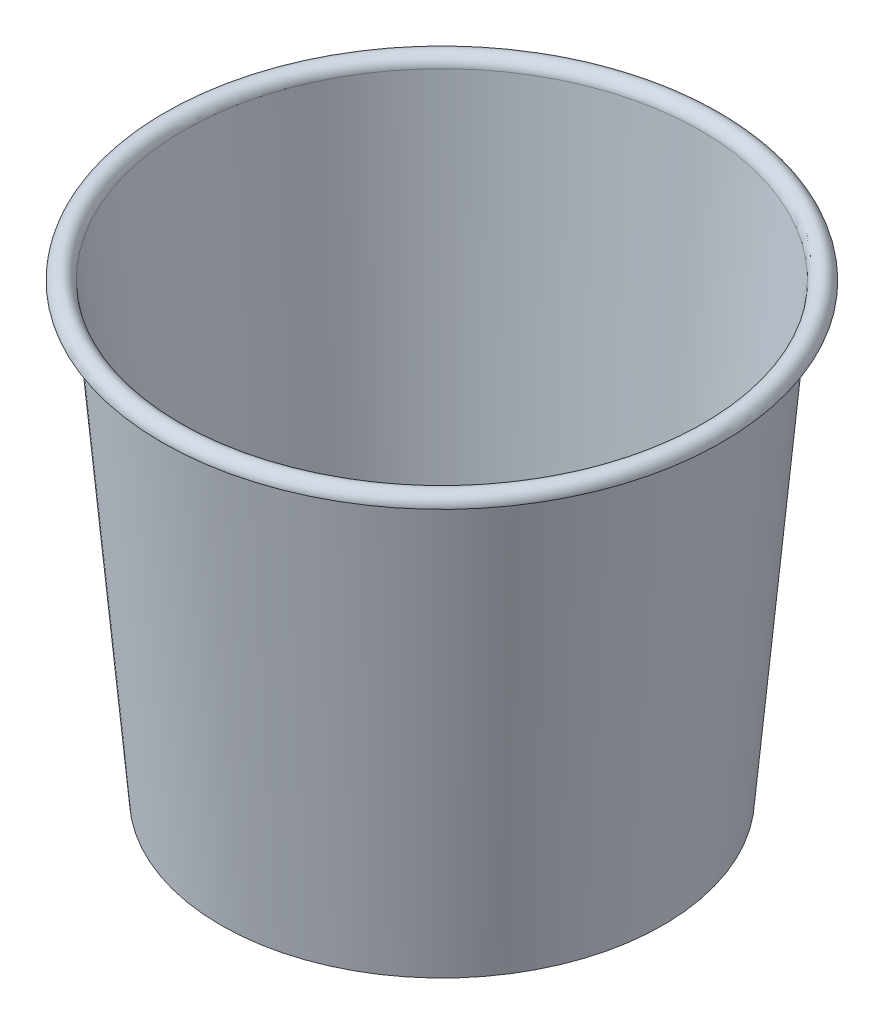
ISO-10303-21;
HEADER;
FILE_DESCRIPTION(('STEP AP214'),'2;1');
FILE_NAME('part.step','',(''),(''),'','','');
FILE_SCHEMA(('AUTOMOTIVE_DESIGN { 1 0 10303 214 1 1 1 1 }'));
ENDSEC;
DATA;
#1=APPLICATION_CONTEXT('core data for automotive mechanical design processes');
#2=APPLICATION_PROTOCOL_DEFINITION('international standard','automotive_design',2000,#1);
#3=PRODUCT_CONTEXT('',#1,'mechanical');
#4=PRODUCT('Part','Part','',(#3));
#5=PRODUCT_RELATED_PRODUCT_CATEGORY('part','',(#4));
#6=PRODUCT_DEFINITION_FORMATION('','',#4);
#7=PRODUCT_DEFINITION_CONTEXT('part definition',#1,'design');
#8=PRODUCT_DEFINITION('design','',#6,#7);
#9=PRODUCT_DEFINITION_SHAPE('','',#8);
#10=(LENGTH_UNIT() NAMED_UNIT(*) SI_UNIT(.MILLI.,.METRE.));
#11=(NAMED_UNIT(*) PLANE_ANGLE_UNIT() SI_UNIT($,.RADIAN.));
#12=(NAMED_UNIT(*) SI_UNIT($,.STERADIAN.) SOLID_ANGLE_UNIT());
#13=UNCERTAINTY_MEASURE_WITH_UNIT(LENGTH_MEASURE(1.E-05),#10,'distance_accuracy_value','');
#14=(GEOMETRIC_REPRESENTATION_CONTEXT(3) GLOBAL_UNCERTAINTY_ASSIGNED_CONTEXT((#13)) GLOBAL_UNIT_ASSIGNED_CONTEXT((#10,
#11,#12)) REPRESENTATION_CONTEXT('',''));
#15=CARTESIAN_POINT('',(0.,0.,0.));
#16=DIRECTION('',(0.,0.,1.));
#17=DIRECTION('',(1.,0.,0.));
#18=AXIS2_PLACEMENT_3D('',#15,#16,#17);
#19=CARTESIAN_POINT('',(0.,1.,0.));
#20=DIRECTION('',(0.,-1.,0.));
#21=DIRECTION('',(0.,0.,-1.));
#22=AXIS2_PLACEMENT_3D('',#19,#20,#21);
#23=PLANE('',#22);
#24=CARTESIAN_POINT('',(0.,1.,0.));
#25=DIRECTION('',(0.,1.,0.));
#26=DIRECTION('',(0.,0.,1.));
#27=AXIS2_PLACEMENT_3D('',#24,#25,#26);
#28=CIRCLE('',#27,123.104498744151);
#29=CARTESIAN_POINT('',(0.,1.,123.104498744151));
#30=VERTEX_POINT('',#29);
#31=EDGE_CURVE('E10',#30,#30,#28,.T.);
#32=ORIENTED_EDGE('',*,*,#31,.T.);
#33=EDGE_LOOP('',(#32));
#34=FACE_BOUND('',#33,.T.);
#35=ADVANCED_FACE('F37',(#34),#23,.F.);
#36=CARTESIAN_POINT('',(0.,251.527693348577,0.));
#37=DIRECTION('',(0.,1.,0.));
#38=DIRECTION('',(0.,0.,1.));
#39=AXIS2_PLACEMENT_3D('',#36,#37,#38);
#40=CONICAL_SURFACE('',#39,145.022831811449,0.0872664625997128);
#41=ORIENTED_EDGE('',*,*,#31,.F.);
#42=EDGE_LOOP('',(#41));
#43=FACE_BOUND('',#42,.T.);
#44=CARTESIAN_POINT('',(0.,251.527693348577,0.));
#45=DIRECTION('',(0.,1.,0.));
#46=DIRECTION('',(0.,0.,1.));
#47=AXIS2_PLACEMENT_3D('',#44,#45,#46);
#48=CIRCLE('',#47,145.022831811449);
#49=CARTESIAN_POINT('',(0.,251.527693348577,145.022831811449));
#50=VERTEX_POINT('',#49);
#51=EDGE_CURVE('E44',#50,#50,#48,.T.);
#52=ORIENTED_EDGE('',*,*,#51,.T.);
#53=EDGE_LOOP('',(#52));
#54=FACE_BOUND('',#53,.T.);
#55=ADVANCED_FACE('F81',(#43,#54),#40,.F.);
#56=CARTESIAN_POINT('',(0.,251.004758892091,0.));
#57=DIRECTION('',(0.,1.,0.));
#58=DIRECTION('',(0.,0.,1.));
#59=AXIS2_PLACEMENT_3D('',#56,#57,#58);
#60=TOROIDAL_SURFACE('',#59,151.,6.00000000000001);
#61=ORIENTED_EDGE('',*,*,#51,.F.);
#62=EDGE_LOOP('',(#61));
#63=FACE_BOUND('',#62,.T.);
#64=CARTESIAN_POINT('',(0.,251.004758892091,0.));
#65=DIRECTION('',(0.,1.,0.));
#66=DIRECTION('',(0.,0.,1.));
#67=AXIS2_PLACEMENT_3D('',#64,#65,#66);
#68=CIRCLE('',#67,157.);
#69=CARTESIAN_POINT('',(0.,251.004758892091,157.));
#70=VERTEX_POINT('',#69);
#71=EDGE_CURVE('E49',#70,#70,#68,.T.);
#72=ORIENTED_EDGE('',*,*,#71,.T.);
#73=EDGE_LOOP('',(#72));
#74=FACE_BOUND('',#73,.T.);
#75=ADVANCED_FACE('F85',(#63,#74),#60,.T.);
#76=CARTESIAN_POINT('',(157.,251.004758892091,0.));
#77=DIRECTION('',(0.,1.,0.));
#78=DIRECTION('',(0.,0.,1.));
#79=AXIS2_PLACEMENT_3D('',#76,#77,#78);
#80=PLANE('',#79);
#81=ORIENTED_EDGE('',*,*,#71,.F.);
#82=EDGE_LOOP('',(#81));
#83=FACE_BOUND('',#82,.T.);
#84=CARTESIAN_POINT('',(0.,251.004758892091,0.));
#85=DIRECTION('',(0.,1.,0.));
#86=DIRECTION('',(0.,0.,1.));
#87=AXIS2_PLACEMENT_3D('',#84,#85,#86);
#88=CIRCLE('',#87,156.);
#89=CARTESIAN_POINT('',(0.,251.004758892091,156.));
#90=VERTEX_POINT('',#89);
#91=EDGE_CURVE('E54',#90,#90,#88,.T.);
#92=ORIENTED_EDGE('',*,*,#91,.T.);
#93=EDGE_LOOP('',(#92));
#94=FACE_BOUND('',#93,.T.);
#95=ADVANCED_FACE('F90',(#83,#94),#80,.F.);
#96=CARTESIAN_POINT('',(0.,251.004758892091,0.));
#97=DIRECTION('',(0.,1.,0.));
#98=DIRECTION('',(0.,0.,1.));
#99=AXIS2_PLACEMENT_3D('',#96,#97,#98);
#100=TOROIDAL_SURFACE('',#99,151.,5.00000000000002);
#101=ORIENTED_EDGE('',*,*,#91,.F.);
#102=EDGE_LOOP('',(#101));
#103=FACE_BOUND('',#102,.T.);
#104=CARTESIAN_POINT('',(0.,251.440537605829,0.));
#105=DIRECTION('',(0.,1.,0.));
#106=DIRECTION('',(0.,0.,1.));
#107=AXIS2_PLACEMENT_3D('',#104,#105,#106);
#108=CIRCLE('',#107,146.019026509541);
#109=CARTESIAN_POINT('',(0.,251.440537605829,146.019026509541));
#110=VERTEX_POINT('',#109);
#111=EDGE_CURVE('E60',#110,#110,#108,.T.);
#112=ORIENTED_EDGE('',*,*,#111,.T.);
#113=EDGE_LOOP('',(#112));
#114=FACE_BOUND('',#113,.T.);
#115=ADVANCED_FACE('F77',(#103,#114),#100,.F.);
#116=CARTESIAN_POINT('',(0.,0.,0.));
#117=DIRECTION('',(0.,1.,0.));
#118=DIRECTION('',(0.,0.,1.));
#119=AXIS2_PLACEMENT_3D('',#116,#117,#118);
#120=CONICAL_SURFACE('',#119,124.020829918168,0.0872664625997128);
#121=ORIENTED_EDGE('',*,*,#111,.F.);
#122=EDGE_LOOP('',(#121));
#123=FACE_BOUND('',#122,.T.);
#124=CARTESIAN_POINT('',(0.,0.,0.));
#125=DIRECTION('',(0.,1.,0.));
#126=DIRECTION('',(0.,0.,1.));
#127=AXIS2_PLACEMENT_3D('',#124,#125,#126);
#128=CIRCLE('',#127,124.020829918168);
#129=CARTESIAN_POINT('',(0.,0.,124.020829918168));
#130=VERTEX_POINT('',#129);
#131=EDGE_CURVE('E64',#130,#130,#128,.T.);
#132=ORIENTED_EDGE('',*,*,#131,.T.);
#133=EDGE_LOOP('',(#132));
#134=FACE_BOUND('',#133,.T.);
#135=ADVANCED_FACE('F69',(#123,#134),#120,.T.);
#136=CARTESIAN_POINT('',(0.,0.,0.));
#137=DIRECTION('',(0.,1.,0.));
#138=DIRECTION('',(0.,0.,1.));
#139=AXIS2_PLACEMENT_3D('',#136,#137,#138);
#140=PLANE('',#139);
#141=ORIENTED_EDGE('',*,*,#131,.F.);
#142=EDGE_LOOP('',(#141));
#143=FACE_BOUND('',#142,.T.);
#144=ADVANCED_FACE('F71',(#143),#140,.F.);
#145=CLOSED_SHELL('',(#35,#55,#75,#95,#115,#135,#144));
#146=MANIFOLD_SOLID_BREP('B2',#145);
#147=ADVANCED_BREP_SHAPE_REPRESENTATION('',(#18,#146),#14);
#148=SHAPE_DEFINITION_REPRESENTATION(#9,#147);
ENDSEC;
END-ISO-10303-21;
